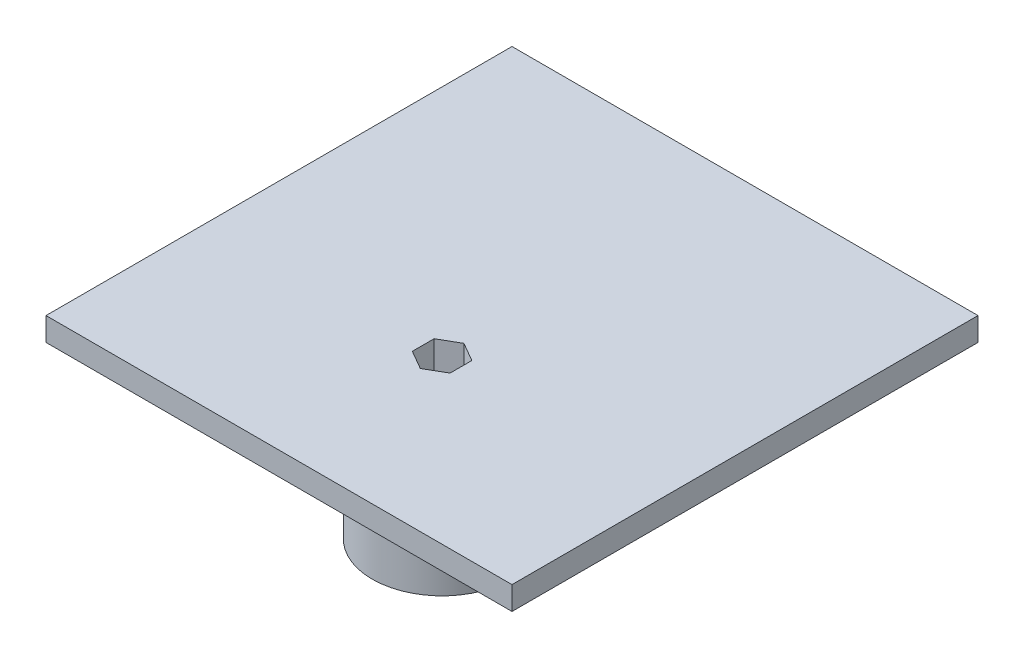
ISO-10303-21;
HEADER;
FILE_DESCRIPTION(('STEP AP214'),'2;1');
FILE_NAME('part.step','',(''),(''),'','','');
FILE_SCHEMA(('AUTOMOTIVE_DESIGN { 1 0 10303 214 1 1 1 1 }'));
ENDSEC;
DATA;
#1=APPLICATION_CONTEXT('core data for automotive mechanical design processes');
#2=APPLICATION_PROTOCOL_DEFINITION('international standard','automotive_design',2000,#1);
#3=PRODUCT_CONTEXT('',#1,'mechanical');
#4=PRODUCT('Part','Part','',(#3));
#5=PRODUCT_RELATED_PRODUCT_CATEGORY('part','',(#4));
#6=PRODUCT_DEFINITION_FORMATION('','',#4);
#7=PRODUCT_DEFINITION_CONTEXT('part definition',#1,'design');
#8=PRODUCT_DEFINITION('design','',#6,#7);
#9=PRODUCT_DEFINITION_SHAPE('','',#8);
#10=(LENGTH_UNIT() NAMED_UNIT(*) SI_UNIT(.MILLI.,.METRE.));
#11=(NAMED_UNIT(*) PLANE_ANGLE_UNIT() SI_UNIT($,.RADIAN.));
#12=(NAMED_UNIT(*) SI_UNIT($,.STERADIAN.) SOLID_ANGLE_UNIT());
#13=UNCERTAINTY_MEASURE_WITH_UNIT(LENGTH_MEASURE(1.E-05),#10,'distance_accuracy_value','');
#14=(GEOMETRIC_REPRESENTATION_CONTEXT(3) GLOBAL_UNCERTAINTY_ASSIGNED_CONTEXT((#13)) GLOBAL_UNIT_ASSIGNED_CONTEXT((#10,
#11,#12)) REPRESENTATION_CONTEXT('',''));
#15=CARTESIAN_POINT('',(0.,0.,0.));
#16=DIRECTION('',(0.,0.,1.));
#17=DIRECTION('',(1.,0.,0.));
#18=AXIS2_PLACEMENT_3D('',#15,#16,#17);
#19=CARTESIAN_POINT('',(0.,5.,15.));
#20=DIRECTION('',(0.,-1.,0.));
#21=DIRECTION('',(0.,0.,-1.));
#22=AXIS2_PLACEMENT_3D('',#19,#20,#21);
#23=CYLINDRICAL_SURFACE('',#22,2.75);
#24=CARTESIAN_POINT('',(0.,-29.,15.));
#25=DIRECTION('',(0.,-1.,0.));
#26=DIRECTION('',(0.,0.,-1.));
#27=AXIS2_PLACEMENT_3D('',#24,#25,#26);
#28=CIRCLE('',#27,2.75);
#29=CARTESIAN_POINT('',(0.,-29.,12.25));
#30=VERTEX_POINT('',#29);
#31=EDGE_CURVE('E241',#30,#30,#28,.F.);
#32=ORIENTED_EDGE('',*,*,#31,.F.);
#33=EDGE_LOOP('',(#32));
#34=FACE_BOUND('',#33,.T.);
#35=CARTESIAN_POINT('',(0.,-25.,15.));
#36=DIRECTION('',(0.,1.,0.));
#37=DIRECTION('',(0.,0.,1.));
#38=AXIS2_PLACEMENT_3D('',#35,#36,#37);
#39=CIRCLE('',#38,2.75);
#40=CARTESIAN_POINT('',(0.,-25.,17.75));
#41=VERTEX_POINT('',#40);
#42=EDGE_CURVE('E178',#41,#41,#39,.F.);
#43=ORIENTED_EDGE('',*,*,#42,.F.);
#44=EDGE_LOOP('',(#43));
#45=FACE_BOUND('',#44,.T.);
#46=ADVANCED_FACE('F37',(#34,#45),#23,.F.);
#47=CARTESIAN_POINT('',(0.,0.,0.));
#48=DIRECTION('',(0.,-1.,0.));
#49=DIRECTION('',(0.,0.,-1.));
#50=AXIS2_PLACEMENT_3D('',#47,#48,#49);
#51=PLANE('',#50);
#52=DIRECTION('',(0.,0.,1.));
#53=VECTOR('',#52,1.);
#54=CARTESIAN_POINT('',(-50.,0.,-50.));
#55=LINE('',#54,#53);
#56=CARTESIAN_POINT('',(-50.,0.,-50.));
#57=VERTEX_POINT('',#56);
#58=CARTESIAN_POINT('',(-50.,0.,50.));
#59=VERTEX_POINT('',#58);
#60=EDGE_CURVE('E254',#57,#59,#55,.T.);
#61=ORIENTED_EDGE('',*,*,#60,.F.);
#62=DIRECTION('',(-1.,0.,0.));
#63=VECTOR('',#62,1.);
#64=CARTESIAN_POINT('',(50.,0.,-50.));
#65=LINE('',#64,#63);
#66=CARTESIAN_POINT('',(50.,0.,-50.));
#67=VERTEX_POINT('',#66);
#68=EDGE_CURVE('E259',#67,#57,#65,.T.);
#69=ORIENTED_EDGE('',*,*,#68,.F.);
#70=DIRECTION('',(0.,0.,-1.));
#71=VECTOR('',#70,1.);
#72=CARTESIAN_POINT('',(50.,0.,-50.));
#73=LINE('',#72,#71);
#74=CARTESIAN_POINT('',(50.,0.,50.));
#75=VERTEX_POINT('',#74);
#76=EDGE_CURVE('E270',#75,#67,#73,.T.);
#77=ORIENTED_EDGE('',*,*,#76,.F.);
#78=DIRECTION('',(1.,0.,0.));
#79=VECTOR('',#78,1.);
#80=CARTESIAN_POINT('',(50.,0.,50.));
#81=LINE('',#80,#79);
#82=EDGE_CURVE('E268',#59,#75,#81,.T.);
#83=ORIENTED_EDGE('',*,*,#82,.F.);
#84=EDGE_LOOP('',(#61,#69,#77,#83));
#85=FACE_BOUND('',#84,.T.);
#86=DIRECTION('',(0.,0.,1.));
#87=VECTOR('',#86,1.);
#88=CARTESIAN_POINT('',(-10.,0.,-50.));
#89=LINE('',#88,#87);
#90=CARTESIAN_POINT('',(-10.,0.,-44.9999999999999));
#91=VERTEX_POINT('',#90);
#92=CARTESIAN_POINT('',(-10.,0.,0.));
#93=VERTEX_POINT('',#92);
#94=EDGE_CURVE('E166',#91,#93,#89,.T.);
#95=ORIENTED_EDGE('',*,*,#94,.F.);
#96=DIRECTION('',(1.,0.,0.));
#97=VECTOR('',#96,1.);
#98=CARTESIAN_POINT('',(0.,0.,-45.));
#99=LINE('',#98,#97);
#100=CARTESIAN_POINT('',(-15.,0.,-45.));
#101=VERTEX_POINT('',#100);
#102=EDGE_CURVE('E227',#101,#91,#99,.T.);
#103=ORIENTED_EDGE('',*,*,#102,.F.);
#104=DIRECTION('',(0.,0.,-1.));
#105=VECTOR('',#104,1.);
#106=CARTESIAN_POINT('',(-15.,0.,0.));
#107=LINE('',#106,#105);
#108=CARTESIAN_POINT('',(-15.,0.,15.));
#109=VERTEX_POINT('',#108);
#110=EDGE_CURVE('E246',#109,#101,#107,.T.);
#111=ORIENTED_EDGE('',*,*,#110,.F.);
#112=CARTESIAN_POINT('',(0.,0.,15.));
#113=DIRECTION('',(0.,-1.,0.));
#114=DIRECTION('',(0.,0.,-1.));
#115=AXIS2_PLACEMENT_3D('',#112,#113,#114);
#116=CIRCLE('',#115,15.);
#117=CARTESIAN_POINT('',(15.,0.,15.));
#118=VERTEX_POINT('',#117);
#119=EDGE_CURVE('E230',#109,#118,#116,.F.);
#120=ORIENTED_EDGE('',*,*,#119,.T.);
#121=DIRECTION('',(0.,0.,-1.));
#122=VECTOR('',#121,1.);
#123=CARTESIAN_POINT('',(15.,0.,0.));
#124=LINE('',#123,#122);
#125=CARTESIAN_POINT('',(15.,0.,-45.));
#126=VERTEX_POINT('',#125);
#127=EDGE_CURVE('E235',#118,#126,#124,.T.);
#128=ORIENTED_EDGE('',*,*,#127,.T.);
#129=CARTESIAN_POINT('',(10.,0.,-44.9999999999999));
#130=VERTEX_POINT('',#129);
#131=EDGE_CURVE('E163',#130,#126,#99,.T.);
#132=ORIENTED_EDGE('',*,*,#131,.F.);
#133=DIRECTION('',(0.,0.,1.));
#134=VECTOR('',#133,1.);
#135=CARTESIAN_POINT('',(10.,0.,-50.));
#136=LINE('',#135,#134);
#137=CARTESIAN_POINT('',(10.,0.,0.));
#138=VERTEX_POINT('',#137);
#139=EDGE_CURVE('E157',#130,#138,#136,.T.);
#140=ORIENTED_EDGE('',*,*,#139,.T.);
#141=DIRECTION('',(-1.,0.,0.));
#142=VECTOR('',#141,1.);
#143=CARTESIAN_POINT('',(0.,0.,0.));
#144=LINE('',#143,#142);
#145=EDGE_CURVE('E160',#138,#93,#144,.T.);
#146=ORIENTED_EDGE('',*,*,#145,.T.);
#147=EDGE_LOOP('',(#95,#103,#111,#120,#128,#132,#140,#146));
#148=FACE_BOUND('',#147,.T.);
#149=ADVANCED_FACE('F159',(#85,#148),#51,.T.);
#150=CARTESIAN_POINT('',(0.,5.,0.));
#151=DIRECTION('',(0.,-1.,0.));
#152=DIRECTION('',(0.,0.,-1.));
#153=AXIS2_PLACEMENT_3D('',#150,#151,#152);
#154=PLANE('',#153);
#155=DIRECTION('',(-0.866025403784439,0.,-0.5));
#156=VECTOR('',#155,1.);
#157=CARTESIAN_POINT('',(-4.47019052838329,5.,7.74259711467301));
#158=LINE('',#157,#156);
#159=CARTESIAN_POINT('',(4.05000000000001,5.,12.661731409782));
#160=VERTEX_POINT('',#159);
#161=CARTESIAN_POINT('',(0.,5.,10.323462819564));
#162=VERTEX_POINT('',#161);
#163=EDGE_CURVE('E202',#160,#162,#158,.T.);
#164=ORIENTED_EDGE('',*,*,#163,.F.);
#165=DIRECTION('',(0.,0.,-1.));
#166=VECTOR('',#165,1.);
#167=CARTESIAN_POINT('',(4.05000000000001,5.,0.));
#168=LINE('',#167,#166);
#169=CARTESIAN_POINT('',(4.05000000000001,5.,17.338268590218));
#170=VERTEX_POINT('',#169);
#171=EDGE_CURVE('E61',#170,#160,#168,.T.);
#172=ORIENTED_EDGE('',*,*,#171,.F.);
#173=DIRECTION('',(0.866025403784439,0.,-0.5));
#174=VECTOR('',#173,1.);
#175=CARTESIAN_POINT('',(8.52019052838329,5.,14.757402885327));
#176=LINE('',#175,#174);
#177=CARTESIAN_POINT('',(0.,5.,19.676537180436));
#178=VERTEX_POINT('',#177);
#179=EDGE_CURVE('E182',#178,#170,#176,.T.);
#180=ORIENTED_EDGE('',*,*,#179,.F.);
#181=DIRECTION('',(0.866025403784438,0.,0.5));
#182=VECTOR('',#181,1.);
#183=CARTESIAN_POINT('',(-8.52019052838329,5.,14.757402885327));
#184=LINE('',#183,#182);
#185=CARTESIAN_POINT('',(-4.04999999999999,5.,17.338268590218));
#186=VERTEX_POINT('',#185);
#187=EDGE_CURVE('E211',#186,#178,#184,.T.);
#188=ORIENTED_EDGE('',*,*,#187,.F.);
#189=DIRECTION('',(0.,0.,1.));
#190=VECTOR('',#189,1.);
#191=CARTESIAN_POINT('',(-4.04999999999999,5.,0.));
#192=LINE('',#191,#190);
#193=CARTESIAN_POINT('',(-4.04999999999999,5.,12.661731409782));
#194=VERTEX_POINT('',#193);
#195=EDGE_CURVE('E208',#194,#186,#192,.T.);
#196=ORIENTED_EDGE('',*,*,#195,.F.);
#197=DIRECTION('',(-0.866025403784439,0.,0.5));
#198=VECTOR('',#197,1.);
#199=CARTESIAN_POINT('',(4.47019052838329,5.,7.74259711467302));
#200=LINE('',#199,#198);
#201=EDGE_CURVE('E205',#162,#194,#200,.T.);
#202=ORIENTED_EDGE('',*,*,#201,.F.);
#203=EDGE_LOOP('',(#164,#172,#180,#188,#196,#202));
#204=FACE_BOUND('',#203,.T.);
#205=DIRECTION('',(0.,0.,1.));
#206=VECTOR('',#205,1.);
#207=CARTESIAN_POINT('',(-50.,5.,-50.));
#208=LINE('',#207,#206);
#209=CARTESIAN_POINT('',(-50.,5.,-50.));
#210=VERTEX_POINT('',#209);
#211=CARTESIAN_POINT('',(-50.,5.,50.));
#212=VERTEX_POINT('',#211);
#213=EDGE_CURVE('E255',#210,#212,#208,.T.);
#214=ORIENTED_EDGE('',*,*,#213,.T.);
#215=DIRECTION('',(1.,0.,0.));
#216=VECTOR('',#215,1.);
#217=CARTESIAN_POINT('',(50.,5.,50.));
#218=LINE('',#217,#216);
#219=CARTESIAN_POINT('',(50.,5.,50.));
#220=VERTEX_POINT('',#219);
#221=EDGE_CURVE('E258',#212,#220,#218,.T.);
#222=ORIENTED_EDGE('',*,*,#221,.T.);
#223=DIRECTION('',(0.,0.,-1.));
#224=VECTOR('',#223,1.);
#225=CARTESIAN_POINT('',(50.,5.,-50.));
#226=LINE('',#225,#224);
#227=CARTESIAN_POINT('',(50.,5.,-50.));
#228=VERTEX_POINT('',#227);
#229=EDGE_CURVE('E261',#220,#228,#226,.T.);
#230=ORIENTED_EDGE('',*,*,#229,.T.);
#231=DIRECTION('',(-1.,0.,0.));
#232=VECTOR('',#231,1.);
#233=CARTESIAN_POINT('',(50.,5.,-50.));
#234=LINE('',#233,#232);
#235=EDGE_CURVE('E263',#228,#210,#234,.T.);
#236=ORIENTED_EDGE('',*,*,#235,.T.);
#237=EDGE_LOOP('',(#214,#222,#230,#236));
#238=FACE_BOUND('',#237,.T.);
#239=ADVANCED_FACE('F328',(#204,#238),#154,.F.);
#240=CARTESIAN_POINT('',(-50.,5.,-50.));
#241=DIRECTION('',(1.,0.,0.));
#242=DIRECTION('',(0.,0.,-1.));
#243=AXIS2_PLACEMENT_3D('',#240,#241,#242);
#244=PLANE('',#243);
#245=ORIENTED_EDGE('',*,*,#60,.T.);
#246=DIRECTION('',(0.,-1.,0.));
#247=VECTOR('',#246,1.);
#248=CARTESIAN_POINT('',(-50.,5.,50.));
#249=LINE('',#248,#247);
#250=EDGE_CURVE('E281',#212,#59,#249,.T.);
#251=ORIENTED_EDGE('',*,*,#250,.F.);
#252=ORIENTED_EDGE('',*,*,#213,.F.);
#253=DIRECTION('',(0.,-1.,0.));
#254=VECTOR('',#253,1.);
#255=CARTESIAN_POINT('',(-50.,5.,-50.));
#256=LINE('',#255,#254);
#257=EDGE_CURVE('E265',#210,#57,#256,.T.);
#258=ORIENTED_EDGE('',*,*,#257,.T.);
#259=EDGE_LOOP('',(#245,#251,#252,#258));
#260=FACE_BOUND('',#259,.T.);
#261=ADVANCED_FACE('F336',(#260),#244,.F.);
#262=CARTESIAN_POINT('',(50.,5.,50.));
#263=DIRECTION('',(0.,0.,-1.));
#264=DIRECTION('',(-1.,0.,0.));
#265=AXIS2_PLACEMENT_3D('',#262,#263,#264);
#266=PLANE('',#265);
#267=ORIENTED_EDGE('',*,*,#82,.T.);
#268=DIRECTION('',(0.,-1.,0.));
#269=VECTOR('',#268,1.);
#270=CARTESIAN_POINT('',(50.,5.,50.));
#271=LINE('',#270,#269);
#272=EDGE_CURVE('E278',#220,#75,#271,.T.);
#273=ORIENTED_EDGE('',*,*,#272,.F.);
#274=ORIENTED_EDGE('',*,*,#221,.F.);
#275=ORIENTED_EDGE('',*,*,#250,.T.);
#276=EDGE_LOOP('',(#267,#273,#274,#275));
#277=FACE_BOUND('',#276,.T.);
#278=ADVANCED_FACE('F346',(#277),#266,.F.);
#279=CARTESIAN_POINT('',(50.,5.,-50.));
#280=DIRECTION('',(-1.,0.,0.));
#281=DIRECTION('',(0.,0.,1.));
#282=AXIS2_PLACEMENT_3D('',#279,#280,#281);
#283=PLANE('',#282);
#284=ORIENTED_EDGE('',*,*,#76,.T.);
#285=DIRECTION('',(0.,-1.,0.));
#286=VECTOR('',#285,1.);
#287=CARTESIAN_POINT('',(50.,5.,-50.));
#288=LINE('',#287,#286);
#289=EDGE_CURVE('E275',#228,#67,#288,.T.);
#290=ORIENTED_EDGE('',*,*,#289,.F.);
#291=ORIENTED_EDGE('',*,*,#229,.F.);
#292=ORIENTED_EDGE('',*,*,#272,.T.);
#293=EDGE_LOOP('',(#284,#290,#291,#292));
#294=FACE_BOUND('',#293,.T.);
#295=ADVANCED_FACE('F342',(#294),#283,.F.);
#296=CARTESIAN_POINT('',(50.,5.,-50.));
#297=DIRECTION('',(0.,0.,1.));
#298=DIRECTION('',(1.,0.,0.));
#299=AXIS2_PLACEMENT_3D('',#296,#297,#298);
#300=PLANE('',#299);
#301=ORIENTED_EDGE('',*,*,#68,.T.);
#302=ORIENTED_EDGE('',*,*,#257,.F.);
#303=ORIENTED_EDGE('',*,*,#235,.F.);
#304=ORIENTED_EDGE('',*,*,#289,.T.);
#305=EDGE_LOOP('',(#301,#302,#303,#304));
#306=FACE_BOUND('',#305,.T.);
#307=ADVANCED_FACE('F339',(#306),#300,.F.);
#308=CARTESIAN_POINT('',(0.,-29.,15.));
#309=DIRECTION('',(0.,1.,0.));
#310=DIRECTION('',(0.,0.,1.));
#311=AXIS2_PLACEMENT_3D('',#308,#309,#310);
#312=CYLINDRICAL_SURFACE('',#311,15.);
#313=ORIENTED_EDGE('',*,*,#119,.F.);
#314=DIRECTION('',(0.,1.,0.));
#315=VECTOR('',#314,1.);
#316=CARTESIAN_POINT('',(-15.,-29.,15.));
#317=LINE('',#316,#315);
#318=CARTESIAN_POINT('',(-15.,-29.,15.));
#319=VERTEX_POINT('',#318);
#320=EDGE_CURVE('E251',#319,#109,#317,.T.);
#321=ORIENTED_EDGE('',*,*,#320,.F.);
#322=CARTESIAN_POINT('',(0.,-29.,15.));
#323=DIRECTION('',(0.,-1.,0.));
#324=DIRECTION('',(0.,0.,-1.));
#325=AXIS2_PLACEMENT_3D('',#322,#323,#324);
#326=CIRCLE('',#325,15.);
#327=CARTESIAN_POINT('',(15.,-29.,15.));
#328=VERTEX_POINT('',#327);
#329=EDGE_CURVE('E231',#319,#328,#326,.F.);
#330=ORIENTED_EDGE('',*,*,#329,.T.);
#331=DIRECTION('',(0.,1.,0.));
#332=VECTOR('',#331,1.);
#333=CARTESIAN_POINT('',(15.,-29.,15.));
#334=LINE('',#333,#332);
#335=EDGE_CURVE('E244',#328,#118,#334,.T.);
#336=ORIENTED_EDGE('',*,*,#335,.T.);
#337=EDGE_LOOP('',(#313,#321,#330,#336));
#338=FACE_BOUND('',#337,.T.);
#339=ADVANCED_FACE('F310',(#338),#312,.T.);
#340=CARTESIAN_POINT('',(-15.,-29.,0.));
#341=DIRECTION('',(1.,0.,0.));
#342=DIRECTION('',(0.,0.,-1.));
#343=AXIS2_PLACEMENT_3D('',#340,#341,#342);
#344=PLANE('',#343);
#345=ORIENTED_EDGE('',*,*,#110,.T.);
#346=DIRECTION('',(0.,-0.537474973705177,0.843279700123642));
#347=VECTOR('',#346,1.);
#348=CARTESIAN_POINT('',(-15.,-29.,0.500000000000183));
#349=LINE('',#348,#347);
#350=CARTESIAN_POINT('',(-15.,-29.,0.500000000000184));
#351=VERTEX_POINT('',#350);
#352=EDGE_CURVE('E290',#101,#351,#349,.T.);
#353=ORIENTED_EDGE('',*,*,#352,.T.);
#354=DIRECTION('',(0.,0.,-1.));
#355=VECTOR('',#354,1.);
#356=CARTESIAN_POINT('',(-15.,-29.,0.));
#357=LINE('',#356,#355);
#358=EDGE_CURVE('E234',#319,#351,#357,.T.);
#359=ORIENTED_EDGE('',*,*,#358,.F.);
#360=ORIENTED_EDGE('',*,*,#320,.T.);
#361=EDGE_LOOP('',(#345,#353,#359,#360));
#362=FACE_BOUND('',#361,.T.);
#363=ADVANCED_FACE('F302',(#362),#344,.F.);
#364=CARTESIAN_POINT('',(15.,-29.,0.));
#365=DIRECTION('',(1.,0.,0.));
#366=DIRECTION('',(0.,0.,-1.));
#367=AXIS2_PLACEMENT_3D('',#364,#365,#366);
#368=PLANE('',#367);
#369=DIRECTION('',(0.,0.,-1.));
#370=VECTOR('',#369,1.);
#371=CARTESIAN_POINT('',(15.,-29.,0.));
#372=LINE('',#371,#370);
#373=CARTESIAN_POINT('',(15.,-29.,0.500000000000191));
#374=VERTEX_POINT('',#373);
#375=EDGE_CURVE('E238',#328,#374,#372,.T.);
#376=ORIENTED_EDGE('',*,*,#375,.T.);
#377=DIRECTION('',(0.,0.537474973705177,-0.843279700123642));
#378=VECTOR('',#377,1.);
#379=CARTESIAN_POINT('',(15.,-28.7733791326749,0.144439673679742));
#380=LINE('',#379,#378);
#381=EDGE_CURVE('E287',#374,#126,#380,.T.);
#382=ORIENTED_EDGE('',*,*,#381,.T.);
#383=ORIENTED_EDGE('',*,*,#127,.F.);
#384=ORIENTED_EDGE('',*,*,#335,.F.);
#385=EDGE_LOOP('',(#376,#382,#383,#384));
#386=FACE_BOUND('',#385,.T.);
#387=ADVANCED_FACE('F313',(#386),#368,.T.);
#388=CARTESIAN_POINT('',(0.,-29.,0.));
#389=DIRECTION('',(0.,-1.,0.));
#390=DIRECTION('',(0.,0.,-1.));
#391=AXIS2_PLACEMENT_3D('',#388,#389,#390);
#392=PLANE('',#391);
#393=ORIENTED_EDGE('',*,*,#358,.T.);
#394=DIRECTION('',(1.,0.,0.));
#395=VECTOR('',#394,1.);
#396=CARTESIAN_POINT('',(15.,-29.,0.500000000000191));
#397=LINE('',#396,#395);
#398=EDGE_CURVE('E284',#351,#374,#397,.T.);
#399=ORIENTED_EDGE('',*,*,#398,.T.);
#400=ORIENTED_EDGE('',*,*,#375,.F.);
#401=ORIENTED_EDGE('',*,*,#329,.F.);
#402=EDGE_LOOP('',(#393,#399,#400,#401));
#403=FACE_BOUND('',#402,.T.);
#404=ORIENTED_EDGE('',*,*,#31,.T.);
#405=EDGE_LOOP('',(#404));
#406=FACE_BOUND('',#405,.T.);
#407=ADVANCED_FACE('F305',(#403,#406),#392,.T.);
#408=CARTESIAN_POINT('',(0.,-29.,0.500000000000188));
#409=DIRECTION('',(0.,-0.843279700123642,-0.537474973705177));
#410=DIRECTION('',(-1.,0.,0.));
#411=AXIS2_PLACEMENT_3D('',#408,#409,#410);
#412=PLANE('',#411);
#413=DIRECTION('',(0.,0.537474973705177,-0.843279700123642));
#414=VECTOR('',#413,1.);
#415=CARTESIAN_POINT('',(-10.,-29.,0.500000000000188));
#416=LINE('',#415,#414);
#417=CARTESIAN_POINT('',(-10.,-28.6813186813186,0.));
#418=VERTEX_POINT('',#417);
#419=EDGE_CURVE('E11',#418,#91,#416,.T.);
#420=ORIENTED_EDGE('',*,*,#419,.F.);
#421=DIRECTION('',(-1.,0.,0.));
#422=VECTOR('',#421,1.);
#423=CARTESIAN_POINT('',(0.,-28.6813186813186,0.));
#424=LINE('',#423,#422);
#425=CARTESIAN_POINT('',(10.,-28.6813186813186,0.));
#426=VERTEX_POINT('',#425);
#427=EDGE_CURVE('E292',#426,#418,#424,.T.);
#428=ORIENTED_EDGE('',*,*,#427,.F.);
#429=DIRECTION('',(0.,0.537474973705177,-0.843279700123642));
#430=VECTOR('',#429,1.);
#431=CARTESIAN_POINT('',(10.,-29.,0.500000000000188));
#432=LINE('',#431,#430);
#433=EDGE_CURVE('E46',#426,#130,#432,.T.);
#434=ORIENTED_EDGE('',*,*,#433,.T.);
#435=ORIENTED_EDGE('',*,*,#131,.T.);
#436=ORIENTED_EDGE('',*,*,#381,.F.);
#437=ORIENTED_EDGE('',*,*,#398,.F.);
#438=ORIENTED_EDGE('',*,*,#352,.F.);
#439=ORIENTED_EDGE('',*,*,#102,.T.);
#440=EDGE_LOOP('',(#420,#428,#434,#435,#436,#437,#438,#439));
#441=FACE_BOUND('',#440,.T.);
#442=ADVANCED_FACE('F40',(#441),#412,.T.);
#443=CARTESIAN_POINT('',(4.05000000000001,-25.,0.));
#444=DIRECTION('',(1.,0.,0.));
#445=DIRECTION('',(0.,0.,-1.));
#446=AXIS2_PLACEMENT_3D('',#443,#444,#445);
#447=PLANE('',#446);
#448=ORIENTED_EDGE('',*,*,#171,.T.);
#449=DIRECTION('',(0.,1.,0.));
#450=VECTOR('',#449,1.);
#451=CARTESIAN_POINT('',(4.05000000000001,-25.,12.661731409782));
#452=LINE('',#451,#450);
#453=CARTESIAN_POINT('',(4.05000000000001,-25.,12.661731409782));
#454=VERTEX_POINT('',#453);
#455=EDGE_CURVE('E200',#454,#160,#452,.T.);
#456=ORIENTED_EDGE('',*,*,#455,.F.);
#457=DIRECTION('',(0.,0.,-1.));
#458=VECTOR('',#457,1.);
#459=CARTESIAN_POINT('',(4.05000000000001,-25.,0.));
#460=LINE('',#459,#458);
#461=CARTESIAN_POINT('',(4.05000000000001,-25.,17.338268590218));
#462=VERTEX_POINT('',#461);
#463=EDGE_CURVE('E181',#462,#454,#460,.T.);
#464=ORIENTED_EDGE('',*,*,#463,.F.);
#465=DIRECTION('',(0.,1.,0.));
#466=VECTOR('',#465,1.);
#467=CARTESIAN_POINT('',(4.05000000000001,-25.,17.338268590218));
#468=LINE('',#467,#466);
#469=EDGE_CURVE('E216',#462,#170,#468,.T.);
#470=ORIENTED_EDGE('',*,*,#469,.T.);
#471=EDGE_LOOP('',(#448,#456,#464,#470));
#472=FACE_BOUND('',#471,.T.);
#473=ADVANCED_FACE('F421',(#472),#447,.F.);
#474=CARTESIAN_POINT('',(8.52019052838329,-25.,14.757402885327));
#475=DIRECTION('',(0.5,0.,0.866025403784439));
#476=DIRECTION('',(0.866025403784439,0.,-0.5));
#477=AXIS2_PLACEMENT_3D('',#474,#475,#476);
#478=PLANE('',#477);
#479=ORIENTED_EDGE('',*,*,#179,.T.);
#480=ORIENTED_EDGE('',*,*,#469,.F.);
#481=DIRECTION('',(0.866025403784439,0.,-0.5));
#482=VECTOR('',#481,1.);
#483=CARTESIAN_POINT('',(8.52019052838329,-25.,14.757402885327));
#484=LINE('',#483,#482);
#485=CARTESIAN_POINT('',(0.,-25.,19.676537180436));
#486=VERTEX_POINT('',#485);
#487=EDGE_CURVE('E197',#486,#462,#484,.T.);
#488=ORIENTED_EDGE('',*,*,#487,.F.);
#489=DIRECTION('',(0.,1.,0.));
#490=VECTOR('',#489,1.);
#491=CARTESIAN_POINT('',(0.,-25.,19.676537180436));
#492=LINE('',#491,#490);
#493=EDGE_CURVE('E218',#486,#178,#492,.T.);
#494=ORIENTED_EDGE('',*,*,#493,.T.);
#495=EDGE_LOOP('',(#479,#480,#488,#494));
#496=FACE_BOUND('',#495,.T.);
#497=ADVANCED_FACE('F425',(#496),#478,.F.);
#498=CARTESIAN_POINT('',(-8.52019052838329,-25.,14.757402885327));
#499=DIRECTION('',(-0.5,0.,0.866025403784438));
#500=DIRECTION('',(0.866025403784438,0.,0.5));
#501=AXIS2_PLACEMENT_3D('',#498,#499,#500);
#502=PLANE('',#501);
#503=ORIENTED_EDGE('',*,*,#187,.T.);
#504=ORIENTED_EDGE('',*,*,#493,.F.);
#505=DIRECTION('',(0.866025403784438,0.,0.5));
#506=VECTOR('',#505,1.);
#507=CARTESIAN_POINT('',(-8.52019052838329,-25.,14.757402885327));
#508=LINE('',#507,#506);
#509=CARTESIAN_POINT('',(-4.04999999999999,-25.,17.338268590218));
#510=VERTEX_POINT('',#509);
#511=EDGE_CURVE('E194',#510,#486,#508,.T.);
#512=ORIENTED_EDGE('',*,*,#511,.F.);
#513=DIRECTION('',(0.,1.,0.));
#514=VECTOR('',#513,1.);
#515=CARTESIAN_POINT('',(-4.04999999999999,-25.,17.338268590218));
#516=LINE('',#515,#514);
#517=EDGE_CURVE('E220',#510,#186,#516,.T.);
#518=ORIENTED_EDGE('',*,*,#517,.T.);
#519=EDGE_LOOP('',(#503,#504,#512,#518));
#520=FACE_BOUND('',#519,.T.);
#521=ADVANCED_FACE('F434',(#520),#502,.F.);
#522=CARTESIAN_POINT('',(-4.04999999999999,-25.,0.));
#523=DIRECTION('',(-1.,0.,0.));
#524=DIRECTION('',(0.,0.,1.));
#525=AXIS2_PLACEMENT_3D('',#522,#523,#524);
#526=PLANE('',#525);
#527=ORIENTED_EDGE('',*,*,#195,.T.);
#528=ORIENTED_EDGE('',*,*,#517,.F.);
#529=DIRECTION('',(0.,0.,1.));
#530=VECTOR('',#529,1.);
#531=CARTESIAN_POINT('',(-4.04999999999999,-25.,0.));
#532=LINE('',#531,#530);
#533=CARTESIAN_POINT('',(-4.04999999999999,-25.,12.661731409782));
#534=VERTEX_POINT('',#533);
#535=EDGE_CURVE('E191',#534,#510,#532,.T.);
#536=ORIENTED_EDGE('',*,*,#535,.F.);
#537=DIRECTION('',(0.,1.,0.));
#538=VECTOR('',#537,1.);
#539=CARTESIAN_POINT('',(-4.04999999999999,-25.,12.661731409782));
#540=LINE('',#539,#538);
#541=EDGE_CURVE('E222',#534,#194,#540,.T.);
#542=ORIENTED_EDGE('',*,*,#541,.T.);
#543=EDGE_LOOP('',(#527,#528,#536,#542));
#544=FACE_BOUND('',#543,.T.);
#545=ADVANCED_FACE('F444',(#544),#526,.F.);
#546=CARTESIAN_POINT('',(4.47019052838329,-25.,7.74259711467302));
#547=DIRECTION('',(-0.5,0.,-0.866025403784439));
#548=DIRECTION('',(-0.866025403784439,0.,0.5));
#549=AXIS2_PLACEMENT_3D('',#546,#547,#548);
#550=PLANE('',#549);
#551=ORIENTED_EDGE('',*,*,#201,.T.);
#552=ORIENTED_EDGE('',*,*,#541,.F.);
#553=DIRECTION('',(-0.866025403784439,0.,0.5));
#554=VECTOR('',#553,1.);
#555=CARTESIAN_POINT('',(4.47019052838329,-25.,7.74259711467302));
#556=LINE('',#555,#554);
#557=CARTESIAN_POINT('',(0.,-25.,10.323462819564));
#558=VERTEX_POINT('',#557);
#559=EDGE_CURVE('E188',#558,#534,#556,.T.);
#560=ORIENTED_EDGE('',*,*,#559,.F.);
#561=DIRECTION('',(0.,1.,0.));
#562=VECTOR('',#561,1.);
#563=CARTESIAN_POINT('',(0.,-25.,10.323462819564));
#564=LINE('',#563,#562);
#565=EDGE_CURVE('E224',#558,#162,#564,.T.);
#566=ORIENTED_EDGE('',*,*,#565,.T.);
#567=EDGE_LOOP('',(#551,#552,#560,#566));
#568=FACE_BOUND('',#567,.T.);
#569=ADVANCED_FACE('F454',(#568),#550,.F.);
#570=CARTESIAN_POINT('',(-4.47019052838329,-25.,7.74259711467301));
#571=DIRECTION('',(0.5,0.,-0.866025403784438));
#572=DIRECTION('',(-0.866025403784439,0.,-0.5));
#573=AXIS2_PLACEMENT_3D('',#570,#571,#572);
#574=PLANE('',#573);
#575=ORIENTED_EDGE('',*,*,#163,.T.);
#576=ORIENTED_EDGE('',*,*,#565,.F.);
#577=DIRECTION('',(-0.866025403784439,0.,-0.5));
#578=VECTOR('',#577,1.);
#579=CARTESIAN_POINT('',(-4.47019052838329,-25.,7.74259711467301));
#580=LINE('',#579,#578);
#581=EDGE_CURVE('E185',#454,#558,#580,.T.);
#582=ORIENTED_EDGE('',*,*,#581,.F.);
#583=ORIENTED_EDGE('',*,*,#455,.T.);
#584=EDGE_LOOP('',(#575,#576,#582,#583));
#585=FACE_BOUND('',#584,.T.);
#586=ADVANCED_FACE('F464',(#585),#574,.F.);
#587=CARTESIAN_POINT('',(0.,-25.,0.));
#588=DIRECTION('',(0.,1.,0.));
#589=DIRECTION('',(0.,0.,1.));
#590=AXIS2_PLACEMENT_3D('',#587,#588,#589);
#591=PLANE('',#590);
#592=ORIENTED_EDGE('',*,*,#42,.T.);
#593=EDGE_LOOP('',(#592));
#594=FACE_BOUND('',#593,.T.);
#595=ORIENTED_EDGE('',*,*,#463,.T.);
#596=ORIENTED_EDGE('',*,*,#581,.T.);
#597=ORIENTED_EDGE('',*,*,#559,.T.);
#598=ORIENTED_EDGE('',*,*,#535,.T.);
#599=ORIENTED_EDGE('',*,*,#511,.T.);
#600=ORIENTED_EDGE('',*,*,#487,.T.);
#601=EDGE_LOOP('',(#595,#596,#597,#598,#599,#600));
#602=FACE_BOUND('',#601,.T.);
#603=ADVANCED_FACE('F474',(#594,#602),#591,.T.);
#604=CARTESIAN_POINT('',(-10.,0.,-50.));
#605=DIRECTION('',(-1.,0.,0.));
#606=DIRECTION('',(0.,-1.,0.));
#607=AXIS2_PLACEMENT_3D('',#604,#605,#606);
#608=PLANE('',#607);
#609=ORIENTED_EDGE('',*,*,#419,.T.);
#610=ORIENTED_EDGE('',*,*,#94,.T.);
#611=DIRECTION('',(0.,-1.,0.));
#612=VECTOR('',#611,1.);
#613=CARTESIAN_POINT('',(-10.,0.,0.));
#614=LINE('',#613,#612);
#615=EDGE_CURVE('E167',#93,#418,#614,.T.);
#616=ORIENTED_EDGE('',*,*,#615,.T.);
#617=EDGE_LOOP('',(#609,#610,#616));
#618=FACE_BOUND('',#617,.T.);
#619=ADVANCED_FACE('F296',(#618),#608,.F.);
#620=CARTESIAN_POINT('',(10.,0.,-50.));
#621=DIRECTION('',(-1.,0.,0.));
#622=DIRECTION('',(0.,-1.,0.));
#623=AXIS2_PLACEMENT_3D('',#620,#621,#622);
#624=PLANE('',#623);
#625=DIRECTION('',(0.,-1.,0.));
#626=VECTOR('',#625,1.);
#627=CARTESIAN_POINT('',(10.,0.,0.));
#628=LINE('',#627,#626);
#629=EDGE_CURVE('E53',#138,#426,#628,.T.);
#630=ORIENTED_EDGE('',*,*,#629,.F.);
#631=ORIENTED_EDGE('',*,*,#139,.F.);
#632=ORIENTED_EDGE('',*,*,#433,.F.);
#633=EDGE_LOOP('',(#630,#631,#632));
#634=FACE_BOUND('',#633,.T.);
#635=ADVANCED_FACE('F169',(#634),#624,.T.);
#636=CARTESIAN_POINT('',(0.,0.,0.));
#637=DIRECTION('',(0.,0.,1.));
#638=DIRECTION('',(1.,0.,0.));
#639=AXIS2_PLACEMENT_3D('',#636,#637,#638);
#640=PLANE('',#639);
#641=ORIENTED_EDGE('',*,*,#427,.T.);
#642=ORIENTED_EDGE('',*,*,#615,.F.);
#643=ORIENTED_EDGE('',*,*,#145,.F.);
#644=ORIENTED_EDGE('',*,*,#629,.T.);
#645=EDGE_LOOP('',(#641,#642,#643,#644));
#646=FACE_BOUND('',#645,.T.);
#647=ADVANCED_FACE('F172',(#646),#640,.F.);
#648=CLOSED_SHELL('',(#46,#149,#239,#261,#278,#295,#307,#339,#363,#387,#407,#442,#473,#497,#521,
#545,#569,#586,#603,#619,#635,#647));
#649=MANIFOLD_SOLID_BREP('B2',#648);
#650=ADVANCED_BREP_SHAPE_REPRESENTATION('',(#18,#649),#14);
#651=SHAPE_DEFINITION_REPRESENTATION(#9,#650);
ENDSEC;
END-ISO-10303-21;
